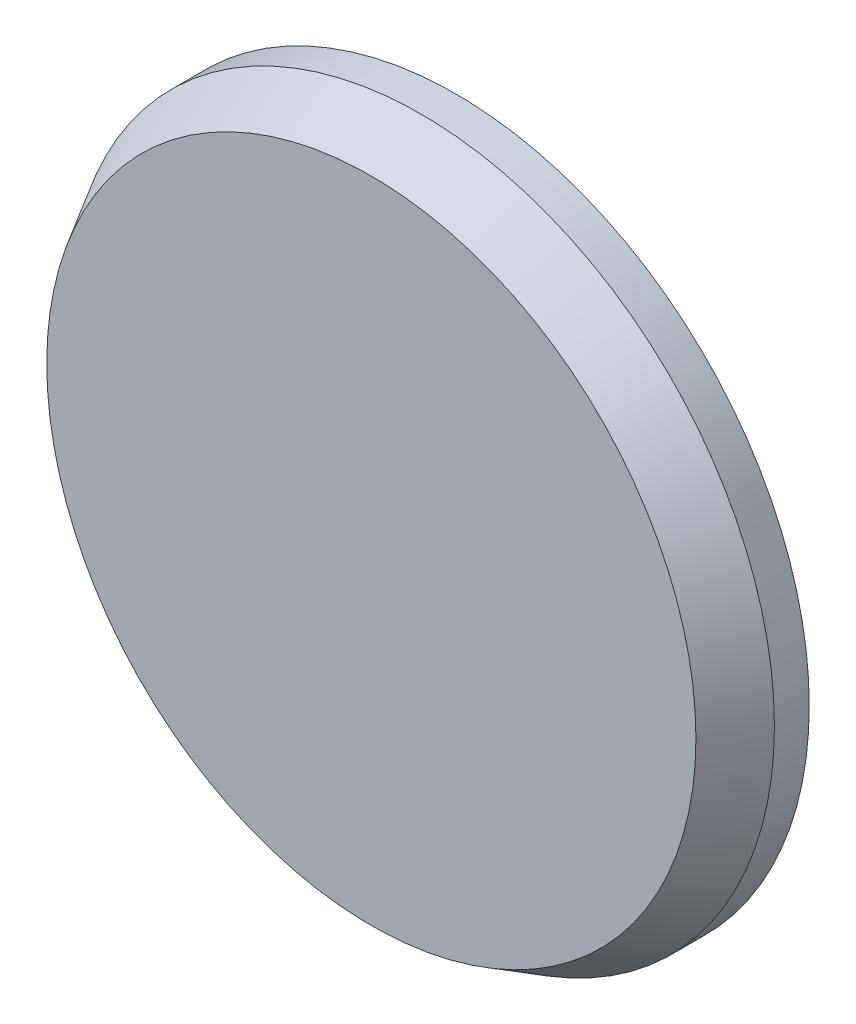
ISO-10303-21;
HEADER;
FILE_DESCRIPTION(('STEP AP214'),'2;1');
FILE_NAME('part.step','',(''),(''),'','','');
FILE_SCHEMA(('AUTOMOTIVE_DESIGN { 1 0 10303 214 1 1 1 1 }'));
ENDSEC;
DATA;
#1=APPLICATION_CONTEXT('core data for automotive mechanical design processes');
#2=APPLICATION_PROTOCOL_DEFINITION('international standard','automotive_design',2000,#1);
#3=PRODUCT_CONTEXT('',#1,'mechanical');
#4=PRODUCT('Part','Part','',(#3));
#5=PRODUCT_RELATED_PRODUCT_CATEGORY('part','',(#4));
#6=PRODUCT_DEFINITION_FORMATION('','',#4);
#7=PRODUCT_DEFINITION_CONTEXT('part definition',#1,'design');
#8=PRODUCT_DEFINITION('design','',#6,#7);
#9=PRODUCT_DEFINITION_SHAPE('','',#8);
#10=(LENGTH_UNIT() NAMED_UNIT(*) SI_UNIT(.MILLI.,.METRE.));
#11=(NAMED_UNIT(*) PLANE_ANGLE_UNIT() SI_UNIT($,.RADIAN.));
#12=(NAMED_UNIT(*) SI_UNIT($,.STERADIAN.) SOLID_ANGLE_UNIT());
#13=UNCERTAINTY_MEASURE_WITH_UNIT(LENGTH_MEASURE(1.E-05),#10,'distance_accuracy_value','');
#14=(GEOMETRIC_REPRESENTATION_CONTEXT(3) GLOBAL_UNCERTAINTY_ASSIGNED_CONTEXT((#13)) GLOBAL_UNIT_ASSIGNED_CONTEXT((#10,
#11,#12)) REPRESENTATION_CONTEXT('',''));
#15=CARTESIAN_POINT('',(0.,0.,0.));
#16=DIRECTION('',(0.,0.,1.));
#17=DIRECTION('',(1.,0.,0.));
#18=AXIS2_PLACEMENT_3D('',#15,#16,#17);
#19=CARTESIAN_POINT('',(0.,0.,0.));
#20=DIRECTION('',(0.,0.,1.));
#21=DIRECTION('',(1.,0.,0.));
#22=AXIS2_PLACEMENT_3D('',#19,#20,#21);
#23=PLANE('',#22);
#24=CARTESIAN_POINT('',(0.,0.,0.));
#25=DIRECTION('',(0.,0.,1.));
#26=DIRECTION('',(1.,0.,0.));
#27=AXIS2_PLACEMENT_3D('',#24,#25,#26);
#28=CIRCLE('',#27,17.75);
#29=CARTESIAN_POINT('',(17.75,0.,0.));
#30=VERTEX_POINT('',#29);
#31=EDGE_CURVE('E197',#30,#30,#28,.T.);
#32=ORIENTED_EDGE('',*,*,#31,.F.);
#33=EDGE_LOOP('',(#32));
#34=FACE_BOUND('',#33,.T.);
#35=DIRECTION('',(0.,1.,0.));
#36=VECTOR('',#35,1.);
#37=CARTESIAN_POINT('',(14.5044820658995,0.,0.));
#38=LINE('',#37,#36);
#39=CARTESIAN_POINT('',(14.5044820658995,-1.15,0.));
#40=VERTEX_POINT('',#39);
#41=CARTESIAN_POINT('',(14.5044820658995,1.15,0.));
#42=VERTEX_POINT('',#41);
#43=EDGE_CURVE('E52',#40,#42,#38,.T.);
#44=ORIENTED_EDGE('',*,*,#43,.T.);
#45=DIRECTION('',(-1.,0.,0.));
#46=VECTOR('',#45,1.);
#47=CARTESIAN_POINT('',(0.,1.15,0.));
#48=LINE('',#47,#46);
#49=CARTESIAN_POINT('',(1.15,1.15,0.));
#50=VERTEX_POINT('',#49);
#51=EDGE_CURVE('E102',#42,#50,#48,.T.);
#52=ORIENTED_EDGE('',*,*,#51,.T.);
#53=DIRECTION('',(0.,1.,0.));
#54=VECTOR('',#53,1.);
#55=CARTESIAN_POINT('',(1.15,0.,0.));
#56=LINE('',#55,#54);
#57=CARTESIAN_POINT('',(1.15,14.5044820658995,0.));
#58=VERTEX_POINT('',#57);
#59=EDGE_CURVE('E191',#50,#58,#56,.T.);
#60=ORIENTED_EDGE('',*,*,#59,.T.);
#61=DIRECTION('',(-1.,0.,0.));
#62=VECTOR('',#61,1.);
#63=CARTESIAN_POINT('',(0.,14.5044820658995,0.));
#64=LINE('',#63,#62);
#65=CARTESIAN_POINT('',(-1.15,14.5044820658995,0.));
#66=VERTEX_POINT('',#65);
#67=EDGE_CURVE('E150',#58,#66,#64,.T.);
#68=ORIENTED_EDGE('',*,*,#67,.T.);
#69=DIRECTION('',(0.,-1.,0.));
#70=VECTOR('',#69,1.);
#71=CARTESIAN_POINT('',(-1.15,0.,0.));
#72=LINE('',#71,#70);
#73=CARTESIAN_POINT('',(-1.15,1.15,0.));
#74=VERTEX_POINT('',#73);
#75=EDGE_CURVE('E187',#66,#74,#72,.T.);
#76=ORIENTED_EDGE('',*,*,#75,.T.);
#77=DIRECTION('',(-1.,0.,0.));
#78=VECTOR('',#77,1.);
#79=CARTESIAN_POINT('',(0.,1.15,0.));
#80=LINE('',#79,#78);
#81=CARTESIAN_POINT('',(-14.5044820658995,1.15,0.));
#82=VERTEX_POINT('',#81);
#83=EDGE_CURVE('E184',#74,#82,#80,.T.);
#84=ORIENTED_EDGE('',*,*,#83,.T.);
#85=DIRECTION('',(0.,-1.,0.));
#86=VECTOR('',#85,1.);
#87=CARTESIAN_POINT('',(-14.5044820658995,0.,0.));
#88=LINE('',#87,#86);
#89=CARTESIAN_POINT('',(-14.5044820658995,-1.15,0.));
#90=VERTEX_POINT('',#89);
#91=EDGE_CURVE('E181',#82,#90,#88,.T.);
#92=ORIENTED_EDGE('',*,*,#91,.T.);
#93=DIRECTION('',(1.,0.,0.));
#94=VECTOR('',#93,1.);
#95=CARTESIAN_POINT('',(0.,-1.15,0.));
#96=LINE('',#95,#94);
#97=CARTESIAN_POINT('',(-1.15,-1.15,0.));
#98=VERTEX_POINT('',#97);
#99=EDGE_CURVE('E178',#90,#98,#96,.T.);
#100=ORIENTED_EDGE('',*,*,#99,.T.);
#101=DIRECTION('',(0.,-1.,0.));
#102=VECTOR('',#101,1.);
#103=CARTESIAN_POINT('',(-1.15,0.,0.));
#104=LINE('',#103,#102);
#105=CARTESIAN_POINT('',(-1.15,-14.5044820658995,0.));
#106=VERTEX_POINT('',#105);
#107=EDGE_CURVE('E175',#98,#106,#104,.T.);
#108=ORIENTED_EDGE('',*,*,#107,.T.);
#109=DIRECTION('',(1.,0.,0.));
#110=VECTOR('',#109,1.);
#111=CARTESIAN_POINT('',(0.,-14.5044820658995,0.));
#112=LINE('',#111,#110);
#113=CARTESIAN_POINT('',(1.15,-14.5044820658995,0.));
#114=VERTEX_POINT('',#113);
#115=EDGE_CURVE('E172',#106,#114,#112,.T.);
#116=ORIENTED_EDGE('',*,*,#115,.T.);
#117=DIRECTION('',(0.,1.,0.));
#118=VECTOR('',#117,1.);
#119=CARTESIAN_POINT('',(1.15,0.,0.));
#120=LINE('',#119,#118);
#121=CARTESIAN_POINT('',(1.15,-1.15,0.));
#122=VERTEX_POINT('',#121);
#123=EDGE_CURVE('E169',#114,#122,#120,.T.);
#124=ORIENTED_EDGE('',*,*,#123,.T.);
#125=DIRECTION('',(1.,0.,0.));
#126=VECTOR('',#125,1.);
#127=CARTESIAN_POINT('',(0.,-1.15,0.));
#128=LINE('',#127,#126);
#129=EDGE_CURVE('E166',#122,#40,#128,.T.);
#130=ORIENTED_EDGE('',*,*,#129,.T.);
#131=EDGE_LOOP('',(#44,#52,#60,#68,#76,#84,#92,#100,#108,#116,#124,#130));
#132=FACE_BOUND('',#131,.T.);
#133=ADVANCED_FACE('F36',(#34,#132),#23,.F.);
#134=CARTESIAN_POINT('',(0.,0.,4.25));
#135=DIRECTION('',(0.,0.,-1.));
#136=DIRECTION('',(-1.,0.,0.));
#137=AXIS2_PLACEMENT_3D('',#134,#135,#136);
#138=CYLINDRICAL_SURFACE('',#137,17.75);
#139=CARTESIAN_POINT('',(0.,0.,1.74999999999997));
#140=DIRECTION('',(0.,0.,1.));
#141=DIRECTION('',(1.,0.,0.));
#142=AXIS2_PLACEMENT_3D('',#139,#140,#141);
#143=CIRCLE('',#142,17.75);
#144=CARTESIAN_POINT('',(17.75,0.,1.74999999999997));
#145=VERTEX_POINT('',#144);
#146=EDGE_CURVE('E11',#145,#145,#143,.F.);
#147=ORIENTED_EDGE('',*,*,#146,.T.);
#148=EDGE_LOOP('',(#147));
#149=FACE_BOUND('',#148,.T.);
#150=ORIENTED_EDGE('',*,*,#31,.T.);
#151=EDGE_LOOP('',(#150));
#152=FACE_BOUND('',#151,.T.);
#153=ADVANCED_FACE('F230',(#149,#152),#138,.T.);
#154=CARTESIAN_POINT('',(0.,0.,4.25));
#155=DIRECTION('',(0.,0.,1.));
#156=DIRECTION('',(1.,0.,0.));
#157=AXIS2_PLACEMENT_3D('',#154,#155,#156);
#158=PLANE('',#157);
#159=CARTESIAN_POINT('',(0.,0.,4.25));
#160=DIRECTION('',(0.,0.,1.));
#161=DIRECTION('',(1.,0.,0.));
#162=AXIS2_PLACEMENT_3D('',#159,#160,#161);
#163=CIRCLE('',#162,16.3066243270259);
#164=CARTESIAN_POINT('',(16.3066243270259,0.,4.25));
#165=VERTEX_POINT('',#164);
#166=EDGE_CURVE('E45',#165,#165,#163,.T.);
#167=ORIENTED_EDGE('',*,*,#166,.T.);
#168=EDGE_LOOP('',(#167));
#169=FACE_BOUND('',#168,.T.);
#170=ADVANCED_FACE('F219',(#169),#158,.T.);
#171=CARTESIAN_POINT('',(14.5044820658995,0.,2.75));
#172=DIRECTION('',(-1.,0.,0.));
#173=DIRECTION('',(0.,0.,1.));
#174=AXIS2_PLACEMENT_3D('',#171,#172,#173);
#175=PLANE('',#174);
#176=ORIENTED_EDGE('',*,*,#43,.F.);
#177=DIRECTION('',(0.,0.,-1.));
#178=VECTOR('',#177,1.);
#179=CARTESIAN_POINT('',(14.5044820658995,-1.15,2.75));
#180=LINE('',#179,#178);
#181=CARTESIAN_POINT('',(14.5044820658995,-1.15,2.75));
#182=VERTEX_POINT('',#181);
#183=EDGE_CURVE('E164',#182,#40,#180,.T.);
#184=ORIENTED_EDGE('',*,*,#183,.F.);
#185=DIRECTION('',(0.,1.,0.));
#186=VECTOR('',#185,1.);
#187=CARTESIAN_POINT('',(14.5044820658995,0.,2.75));
#188=LINE('',#187,#186);
#189=CARTESIAN_POINT('',(14.5044820658995,1.15,2.75));
#190=VERTEX_POINT('',#189);
#191=EDGE_CURVE('E194',#182,#190,#188,.T.);
#192=ORIENTED_EDGE('',*,*,#191,.T.);
#193=DIRECTION('',(0.,0.,-1.));
#194=VECTOR('',#193,1.);
#195=CARTESIAN_POINT('',(14.5044820658995,1.15,2.75));
#196=LINE('',#195,#194);
#197=EDGE_CURVE('E195',#190,#42,#196,.T.);
#198=ORIENTED_EDGE('',*,*,#197,.T.);
#199=EDGE_LOOP('',(#176,#184,#192,#198));
#200=FACE_BOUND('',#199,.T.);
#201=ADVANCED_FACE('F242',(#200),#175,.T.);
#202=CARTESIAN_POINT('',(0.,1.15,2.75));
#203=DIRECTION('',(0.,-1.,0.));
#204=DIRECTION('',(1.,0.,0.));
#205=AXIS2_PLACEMENT_3D('',#202,#203,#204);
#206=PLANE('',#205);
#207=ORIENTED_EDGE('',*,*,#51,.F.);
#208=ORIENTED_EDGE('',*,*,#197,.F.);
#209=DIRECTION('',(-1.,0.,0.));
#210=VECTOR('',#209,1.);
#211=CARTESIAN_POINT('',(0.,1.15,2.75));
#212=LINE('',#211,#210);
#213=CARTESIAN_POINT('',(1.15,1.15,2.75));
#214=VERTEX_POINT('',#213);
#215=EDGE_CURVE('E61',#190,#214,#212,.T.);
#216=ORIENTED_EDGE('',*,*,#215,.T.);
#217=DIRECTION('',(0.,0.,-1.));
#218=VECTOR('',#217,1.);
#219=CARTESIAN_POINT('',(1.15,1.15,2.75));
#220=LINE('',#219,#218);
#221=EDGE_CURVE('E142',#214,#50,#220,.T.);
#222=ORIENTED_EDGE('',*,*,#221,.T.);
#223=EDGE_LOOP('',(#207,#208,#216,#222));
#224=FACE_BOUND('',#223,.T.);
#225=ADVANCED_FACE('F245',(#224),#206,.T.);
#226=CARTESIAN_POINT('',(1.15,0.,2.75));
#227=DIRECTION('',(-1.,0.,0.));
#228=DIRECTION('',(0.,0.,1.));
#229=AXIS2_PLACEMENT_3D('',#226,#227,#228);
#230=PLANE('',#229);
#231=ORIENTED_EDGE('',*,*,#59,.F.);
#232=ORIENTED_EDGE('',*,*,#221,.F.);
#233=DIRECTION('',(0.,1.,0.));
#234=VECTOR('',#233,1.);
#235=CARTESIAN_POINT('',(1.15,0.,2.75));
#236=LINE('',#235,#234);
#237=CARTESIAN_POINT('',(1.15,14.5044820658995,2.75));
#238=VERTEX_POINT('',#237);
#239=EDGE_CURVE('E136',#214,#238,#236,.T.);
#240=ORIENTED_EDGE('',*,*,#239,.T.);
#241=DIRECTION('',(0.,0.,-1.));
#242=VECTOR('',#241,1.);
#243=CARTESIAN_POINT('',(1.15,14.5044820658995,2.75));
#244=LINE('',#243,#242);
#245=EDGE_CURVE('E140',#238,#58,#244,.T.);
#246=ORIENTED_EDGE('',*,*,#245,.T.);
#247=EDGE_LOOP('',(#231,#232,#240,#246));
#248=FACE_BOUND('',#247,.T.);
#249=ADVANCED_FACE('F139',(#248),#230,.T.);
#250=CARTESIAN_POINT('',(0.,14.5044820658995,2.75));
#251=DIRECTION('',(0.,-1.,0.));
#252=DIRECTION('',(0.,0.,-1.));
#253=AXIS2_PLACEMENT_3D('',#250,#251,#252);
#254=PLANE('',#253);
#255=ORIENTED_EDGE('',*,*,#67,.F.);
#256=ORIENTED_EDGE('',*,*,#245,.F.);
#257=DIRECTION('',(-1.,0.,0.));
#258=VECTOR('',#257,1.);
#259=CARTESIAN_POINT('',(0.,14.5044820658995,2.75));
#260=LINE('',#259,#258);
#261=CARTESIAN_POINT('',(-1.15,14.5044820658995,2.75));
#262=VERTEX_POINT('',#261);
#263=EDGE_CURVE('E144',#238,#262,#260,.T.);
#264=ORIENTED_EDGE('',*,*,#263,.T.);
#265=DIRECTION('',(0.,0.,-1.));
#266=VECTOR('',#265,1.);
#267=CARTESIAN_POINT('',(-1.15,14.5044820658995,2.75));
#268=LINE('',#267,#266);
#269=EDGE_CURVE('E152',#262,#66,#268,.T.);
#270=ORIENTED_EDGE('',*,*,#269,.T.);
#271=EDGE_LOOP('',(#255,#256,#264,#270));
#272=FACE_BOUND('',#271,.T.);
#273=ADVANCED_FACE('F147',(#272),#254,.T.);
#274=CARTESIAN_POINT('',(-1.15,0.,2.75));
#275=DIRECTION('',(1.,0.,0.));
#276=DIRECTION('',(0.,0.,-1.));
#277=AXIS2_PLACEMENT_3D('',#274,#275,#276);
#278=PLANE('',#277);
#279=ORIENTED_EDGE('',*,*,#75,.F.);
#280=ORIENTED_EDGE('',*,*,#269,.F.);
#281=DIRECTION('',(0.,-1.,0.));
#282=VECTOR('',#281,1.);
#283=CARTESIAN_POINT('',(-1.15,0.,2.75));
#284=LINE('',#283,#282);
#285=CARTESIAN_POINT('',(-1.15,1.15,2.75));
#286=VERTEX_POINT('',#285);
#287=EDGE_CURVE('E157',#262,#286,#284,.T.);
#288=ORIENTED_EDGE('',*,*,#287,.T.);
#289=DIRECTION('',(0.,0.,-1.));
#290=VECTOR('',#289,1.);
#291=CARTESIAN_POINT('',(-1.15,1.15,2.75));
#292=LINE('',#291,#290);
#293=EDGE_CURVE('E200',#286,#74,#292,.T.);
#294=ORIENTED_EDGE('',*,*,#293,.T.);
#295=EDGE_LOOP('',(#279,#280,#288,#294));
#296=FACE_BOUND('',#295,.T.);
#297=ADVANCED_FACE('F271',(#296),#278,.T.);
#298=CARTESIAN_POINT('',(0.,1.15,2.75));
#299=DIRECTION('',(0.,-1.,0.));
#300=DIRECTION('',(1.,0.,0.));
#301=AXIS2_PLACEMENT_3D('',#298,#299,#300);
#302=PLANE('',#301);
#303=ORIENTED_EDGE('',*,*,#83,.F.);
#304=ORIENTED_EDGE('',*,*,#293,.F.);
#305=DIRECTION('',(-1.,0.,0.));
#306=VECTOR('',#305,1.);
#307=CARTESIAN_POINT('',(0.,1.15,2.75));
#308=LINE('',#307,#306);
#309=CARTESIAN_POINT('',(-14.5044820658995,1.15,2.75));
#310=VERTEX_POINT('',#309);
#311=EDGE_CURVE('E159',#286,#310,#308,.T.);
#312=ORIENTED_EDGE('',*,*,#311,.T.);
#313=DIRECTION('',(0.,0.,-1.));
#314=VECTOR('',#313,1.);
#315=CARTESIAN_POINT('',(-14.5044820658995,1.15,2.75));
#316=LINE('',#315,#314);
#317=EDGE_CURVE('E202',#310,#82,#316,.T.);
#318=ORIENTED_EDGE('',*,*,#317,.T.);
#319=EDGE_LOOP('',(#303,#304,#312,#318));
#320=FACE_BOUND('',#319,.T.);
#321=ADVANCED_FACE('F267',(#320),#302,.T.);
#322=CARTESIAN_POINT('',(-14.5044820658995,0.,2.75));
#323=DIRECTION('',(1.,0.,0.));
#324=DIRECTION('',(0.,0.,-1.));
#325=AXIS2_PLACEMENT_3D('',#322,#323,#324);
#326=PLANE('',#325);
#327=ORIENTED_EDGE('',*,*,#91,.F.);
#328=ORIENTED_EDGE('',*,*,#317,.F.);
#329=DIRECTION('',(0.,-1.,0.));
#330=VECTOR('',#329,1.);
#331=CARTESIAN_POINT('',(-14.5044820658995,0.,2.75));
#332=LINE('',#331,#330);
#333=CARTESIAN_POINT('',(-14.5044820658995,-1.15,2.75));
#334=VERTEX_POINT('',#333);
#335=EDGE_CURVE('E396',#310,#334,#332,.T.);
#336=ORIENTED_EDGE('',*,*,#335,.T.);
#337=DIRECTION('',(0.,0.,-1.));
#338=VECTOR('',#337,1.);
#339=CARTESIAN_POINT('',(-14.5044820658995,-1.15,2.75));
#340=LINE('',#339,#338);
#341=EDGE_CURVE('E204',#334,#90,#340,.T.);
#342=ORIENTED_EDGE('',*,*,#341,.T.);
#343=EDGE_LOOP('',(#327,#328,#336,#342));
#344=FACE_BOUND('',#343,.T.);
#345=ADVANCED_FACE('F263',(#344),#326,.T.);
#346=CARTESIAN_POINT('',(0.,-1.15,2.75));
#347=DIRECTION('',(0.,1.,0.));
#348=DIRECTION('',(-1.,0.,0.));
#349=AXIS2_PLACEMENT_3D('',#346,#347,#348);
#350=PLANE('',#349);
#351=ORIENTED_EDGE('',*,*,#99,.F.);
#352=ORIENTED_EDGE('',*,*,#341,.F.);
#353=DIRECTION('',(1.,0.,0.));
#354=VECTOR('',#353,1.);
#355=CARTESIAN_POINT('',(0.,-1.15,2.75));
#356=LINE('',#355,#354);
#357=CARTESIAN_POINT('',(-1.15,-1.15,2.75));
#358=VERTEX_POINT('',#357);
#359=EDGE_CURVE('E394',#334,#358,#356,.T.);
#360=ORIENTED_EDGE('',*,*,#359,.T.);
#361=DIRECTION('',(0.,0.,-1.));
#362=VECTOR('',#361,1.);
#363=CARTESIAN_POINT('',(-1.15,-1.15,2.75));
#364=LINE('',#363,#362);
#365=EDGE_CURVE('E206',#358,#98,#364,.T.);
#366=ORIENTED_EDGE('',*,*,#365,.T.);
#367=EDGE_LOOP('',(#351,#352,#360,#366));
#368=FACE_BOUND('',#367,.T.);
#369=ADVANCED_FACE('F259',(#368),#350,.T.);
#370=CARTESIAN_POINT('',(-1.15,0.,2.75));
#371=DIRECTION('',(1.,0.,0.));
#372=DIRECTION('',(0.,0.,-1.));
#373=AXIS2_PLACEMENT_3D('',#370,#371,#372);
#374=PLANE('',#373);
#375=ORIENTED_EDGE('',*,*,#107,.F.);
#376=ORIENTED_EDGE('',*,*,#365,.F.);
#377=DIRECTION('',(0.,-1.,0.));
#378=VECTOR('',#377,1.);
#379=CARTESIAN_POINT('',(-1.15,0.,2.75));
#380=LINE('',#379,#378);
#381=CARTESIAN_POINT('',(-1.15,-14.5044820658995,2.75));
#382=VERTEX_POINT('',#381);
#383=EDGE_CURVE('E392',#358,#382,#380,.T.);
#384=ORIENTED_EDGE('',*,*,#383,.T.);
#385=DIRECTION('',(0.,0.,-1.));
#386=VECTOR('',#385,1.);
#387=CARTESIAN_POINT('',(-1.15,-14.5044820658995,2.75));
#388=LINE('',#387,#386);
#389=EDGE_CURVE('E208',#382,#106,#388,.T.);
#390=ORIENTED_EDGE('',*,*,#389,.T.);
#391=EDGE_LOOP('',(#375,#376,#384,#390));
#392=FACE_BOUND('',#391,.T.);
#393=ADVANCED_FACE('F255',(#392),#374,.T.);
#394=CARTESIAN_POINT('',(0.,-14.5044820658995,2.75));
#395=DIRECTION('',(0.,1.,0.));
#396=DIRECTION('',(0.,0.,1.));
#397=AXIS2_PLACEMENT_3D('',#394,#395,#396);
#398=PLANE('',#397);
#399=ORIENTED_EDGE('',*,*,#115,.F.);
#400=ORIENTED_EDGE('',*,*,#389,.F.);
#401=DIRECTION('',(1.,0.,0.));
#402=VECTOR('',#401,1.);
#403=CARTESIAN_POINT('',(0.,-14.5044820658995,2.75));
#404=LINE('',#403,#402);
#405=CARTESIAN_POINT('',(1.15,-14.5044820658995,2.75));
#406=VERTEX_POINT('',#405);
#407=EDGE_CURVE('E390',#382,#406,#404,.T.);
#408=ORIENTED_EDGE('',*,*,#407,.T.);
#409=DIRECTION('',(0.,0.,-1.));
#410=VECTOR('',#409,1.);
#411=CARTESIAN_POINT('',(1.15,-14.5044820658995,2.75));
#412=LINE('',#411,#410);
#413=EDGE_CURVE('E210',#406,#114,#412,.T.);
#414=ORIENTED_EDGE('',*,*,#413,.T.);
#415=EDGE_LOOP('',(#399,#400,#408,#414));
#416=FACE_BOUND('',#415,.T.);
#417=ADVANCED_FACE('F251',(#416),#398,.T.);
#418=CARTESIAN_POINT('',(1.15,0.,2.75));
#419=DIRECTION('',(-1.,0.,0.));
#420=DIRECTION('',(0.,0.,1.));
#421=AXIS2_PLACEMENT_3D('',#418,#419,#420);
#422=PLANE('',#421);
#423=ORIENTED_EDGE('',*,*,#123,.F.);
#424=ORIENTED_EDGE('',*,*,#413,.F.);
#425=DIRECTION('',(0.,1.,0.));
#426=VECTOR('',#425,1.);
#427=CARTESIAN_POINT('',(1.15,0.,2.75));
#428=LINE('',#427,#426);
#429=CARTESIAN_POINT('',(1.15,-1.15,2.75));
#430=VERTEX_POINT('',#429);
#431=EDGE_CURVE('E386',#406,#430,#428,.T.);
#432=ORIENTED_EDGE('',*,*,#431,.T.);
#433=DIRECTION('',(0.,0.,-1.));
#434=VECTOR('',#433,1.);
#435=CARTESIAN_POINT('',(1.15,-1.15,2.75));
#436=LINE('',#435,#434);
#437=EDGE_CURVE('E212',#430,#122,#436,.T.);
#438=ORIENTED_EDGE('',*,*,#437,.T.);
#439=EDGE_LOOP('',(#423,#424,#432,#438));
#440=FACE_BOUND('',#439,.T.);
#441=ADVANCED_FACE('F248',(#440),#422,.T.);
#442=CARTESIAN_POINT('',(0.,-1.15,2.75));
#443=DIRECTION('',(0.,1.,0.));
#444=DIRECTION('',(-1.,0.,0.));
#445=AXIS2_PLACEMENT_3D('',#442,#443,#444);
#446=PLANE('',#445);
#447=ORIENTED_EDGE('',*,*,#129,.F.);
#448=ORIENTED_EDGE('',*,*,#437,.F.);
#449=DIRECTION('',(1.,0.,0.));
#450=VECTOR('',#449,1.);
#451=CARTESIAN_POINT('',(0.,-1.15,2.75));
#452=LINE('',#451,#450);
#453=EDGE_CURVE('E109',#430,#182,#452,.T.);
#454=ORIENTED_EDGE('',*,*,#453,.T.);
#455=ORIENTED_EDGE('',*,*,#183,.T.);
#456=EDGE_LOOP('',(#447,#448,#454,#455));
#457=FACE_BOUND('',#456,.T.);
#458=ADVANCED_FACE('F226',(#457),#446,.T.);
#459=CARTESIAN_POINT('',(0.,0.,2.75));
#460=DIRECTION('',(0.,0.,-1.));
#461=DIRECTION('',(-1.,0.,0.));
#462=AXIS2_PLACEMENT_3D('',#459,#460,#461);
#463=PLANE('',#462);
#464=ORIENTED_EDGE('',*,*,#191,.F.);
#465=ORIENTED_EDGE('',*,*,#453,.F.);
#466=ORIENTED_EDGE('',*,*,#431,.F.);
#467=ORIENTED_EDGE('',*,*,#407,.F.);
#468=ORIENTED_EDGE('',*,*,#383,.F.);
#469=ORIENTED_EDGE('',*,*,#359,.F.);
#470=ORIENTED_EDGE('',*,*,#335,.F.);
#471=ORIENTED_EDGE('',*,*,#311,.F.);
#472=ORIENTED_EDGE('',*,*,#287,.F.);
#473=ORIENTED_EDGE('',*,*,#263,.F.);
#474=ORIENTED_EDGE('',*,*,#239,.F.);
#475=ORIENTED_EDGE('',*,*,#215,.F.);
#476=EDGE_LOOP('',(#464,#465,#466,#467,#468,#469,#470,#471,#472,#473,#474,#475));
#477=FACE_BOUND('',#476,.T.);
#478=ADVANCED_FACE('F155',(#477),#463,.T.);
#479=CARTESIAN_POINT('',(0.,0.,4.25));
#480=DIRECTION('',(0.,0.,-1.));
#481=DIRECTION('',(-1.,0.,0.));
#482=AXIS2_PLACEMENT_3D('',#479,#480,#481);
#483=CONICAL_SURFACE('',#482,16.3066243270259,0.523598775598294);
#484=ORIENTED_EDGE('',*,*,#146,.F.);
#485=EDGE_LOOP('',(#484));
#486=FACE_BOUND('',#485,.T.);
#487=ORIENTED_EDGE('',*,*,#166,.F.);
#488=EDGE_LOOP('',(#487));
#489=FACE_BOUND('',#488,.T.);
#490=ADVANCED_FACE('F39',(#486,#489),#483,.T.);
#491=CLOSED_SHELL('',(#133,#153,#170,#201,#225,#249,#273,#297,#321,#345,#369,#393,#417,#441,
#458,#478,#490));
#492=MANIFOLD_SOLID_BREP('B2',#491);
#493=ADVANCED_BREP_SHAPE_REPRESENTATION('',(#18,#492),#14);
#494=SHAPE_DEFINITION_REPRESENTATION(#9,#493);
ENDSEC;
END-ISO-10303-21;
